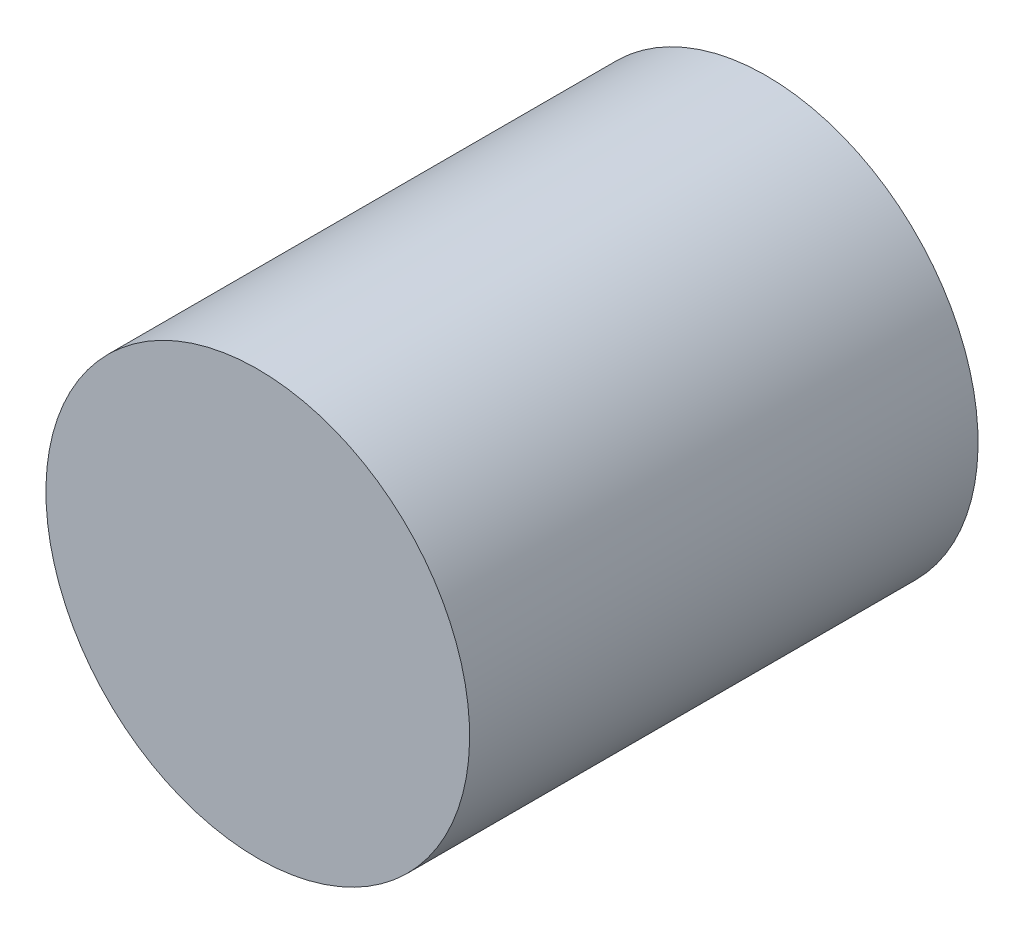
ISO-10303-21;
HEADER;
FILE_DESCRIPTION(('STEP AP214'),'2;1');
FILE_NAME('part.step','',(''),(''),'','','');
FILE_SCHEMA(('AUTOMOTIVE_DESIGN { 1 0 10303 214 1 1 1 1 }'));
ENDSEC;
DATA;
#1=APPLICATION_CONTEXT('core data for automotive mechanical design processes');
#2=APPLICATION_PROTOCOL_DEFINITION('international standard','automotive_design',2000,#1);
#3=PRODUCT_CONTEXT('',#1,'mechanical');
#4=PRODUCT('Part','Part','',(#3));
#5=PRODUCT_RELATED_PRODUCT_CATEGORY('part','',(#4));
#6=PRODUCT_DEFINITION_FORMATION('','',#4);
#7=PRODUCT_DEFINITION_CONTEXT('part definition',#1,'design');
#8=PRODUCT_DEFINITION('design','',#6,#7);
#9=PRODUCT_DEFINITION_SHAPE('','',#8);
#10=(LENGTH_UNIT() NAMED_UNIT(*) SI_UNIT(.MILLI.,.METRE.));
#11=(NAMED_UNIT(*) PLANE_ANGLE_UNIT() SI_UNIT($,.RADIAN.));
#12=(NAMED_UNIT(*) SI_UNIT($,.STERADIAN.) SOLID_ANGLE_UNIT());
#13=UNCERTAINTY_MEASURE_WITH_UNIT(LENGTH_MEASURE(1.E-05),#10,'distance_accuracy_value','');
#14=(GEOMETRIC_REPRESENTATION_CONTEXT(3) GLOBAL_UNCERTAINTY_ASSIGNED_CONTEXT((#13)) GLOBAL_UNIT_ASSIGNED_CONTEXT((#10,
#11,#12)) REPRESENTATION_CONTEXT('',''));
#15=CARTESIAN_POINT('',(0.,0.,0.));
#16=DIRECTION('',(0.,0.,1.));
#17=DIRECTION('',(1.,0.,0.));
#18=AXIS2_PLACEMENT_3D('',#15,#16,#17);
#19=CARTESIAN_POINT('',(-2.37499999999979,-4.11362066797587,33.5));
#20=DIRECTION('',(0.,0.,1.));
#21=DIRECTION('',(-0.500000000000004,-0.866025403784436,0.));
#22=AXIS2_PLACEMENT_3D('',#19,#20,#21);
#23=CYLINDRICAL_SURFACE('',#22,1.25);
#24=CARTESIAN_POINT('',(-2.37499999999979,-4.11362066797587,33.5));
#25=DIRECTION('',(0.,0.,1.));
#26=DIRECTION('',(-0.500000000000004,-0.866025403784436,0.));
#27=AXIS2_PLACEMENT_3D('',#24,#25,#26);
#28=CIRCLE('',#27,1.25);
#29=CARTESIAN_POINT('',(-2.9999999999998,-5.19615242270642,33.5));
#30=VERTEX_POINT('',#29);
#31=EDGE_CURVE('E10',#30,#30,#28,.T.);
#32=ORIENTED_EDGE('',*,*,#31,.T.);
#33=EDGE_LOOP('',(#32));
#34=FACE_BOUND('',#33,.T.);
#35=CARTESIAN_POINT('',(-2.37499999999978,-4.11362066797586,36.5));
#36=DIRECTION('',(0.,0.,1.));
#37=DIRECTION('',(-0.500000000000004,-0.866025403784436,0.));
#38=AXIS2_PLACEMENT_3D('',#35,#36,#37);
#39=CIRCLE('',#38,1.25);
#40=CARTESIAN_POINT('',(-2.99999999999978,-5.19615242270641,36.5));
#41=VERTEX_POINT('',#40);
#42=EDGE_CURVE('E44',#41,#41,#39,.T.);
#43=ORIENTED_EDGE('',*,*,#42,.F.);
#44=EDGE_LOOP('',(#43));
#45=FACE_BOUND('',#44,.T.);
#46=ADVANCED_FACE('F41',(#34,#45),#23,.T.);
#47=CARTESIAN_POINT('',(-2.37499999999979,-4.11362066797587,33.5));
#48=DIRECTION('',(0.,0.,1.));
#49=DIRECTION('',(-0.500000000000004,-0.866025403784436,0.));
#50=AXIS2_PLACEMENT_3D('',#47,#48,#49);
#51=PLANE('',#50);
#52=ORIENTED_EDGE('',*,*,#31,.F.);
#53=EDGE_LOOP('',(#52));
#54=FACE_BOUND('',#53,.T.);
#55=ADVANCED_FACE('F56',(#54),#51,.F.);
#56=CARTESIAN_POINT('',(-2.37499999999978,-4.11362066797586,36.5));
#57=DIRECTION('',(0.,0.,1.));
#58=DIRECTION('',(-0.500000000000004,-0.866025403784436,0.));
#59=AXIS2_PLACEMENT_3D('',#56,#57,#58);
#60=PLANE('',#59);
#61=ORIENTED_EDGE('',*,*,#42,.T.);
#62=EDGE_LOOP('',(#61));
#63=FACE_BOUND('',#62,.T.);
#64=ADVANCED_FACE('F53',(#63),#60,.T.);
#65=CLOSED_SHELL('',(#46,#55,#64));
#66=MANIFOLD_SOLID_BREP('B2',#65);
#67=ADVANCED_BREP_SHAPE_REPRESENTATION('',(#18,#66),#14);
#68=SHAPE_DEFINITION_REPRESENTATION(#9,#67);
ENDSEC;
END-ISO-10303-21;
